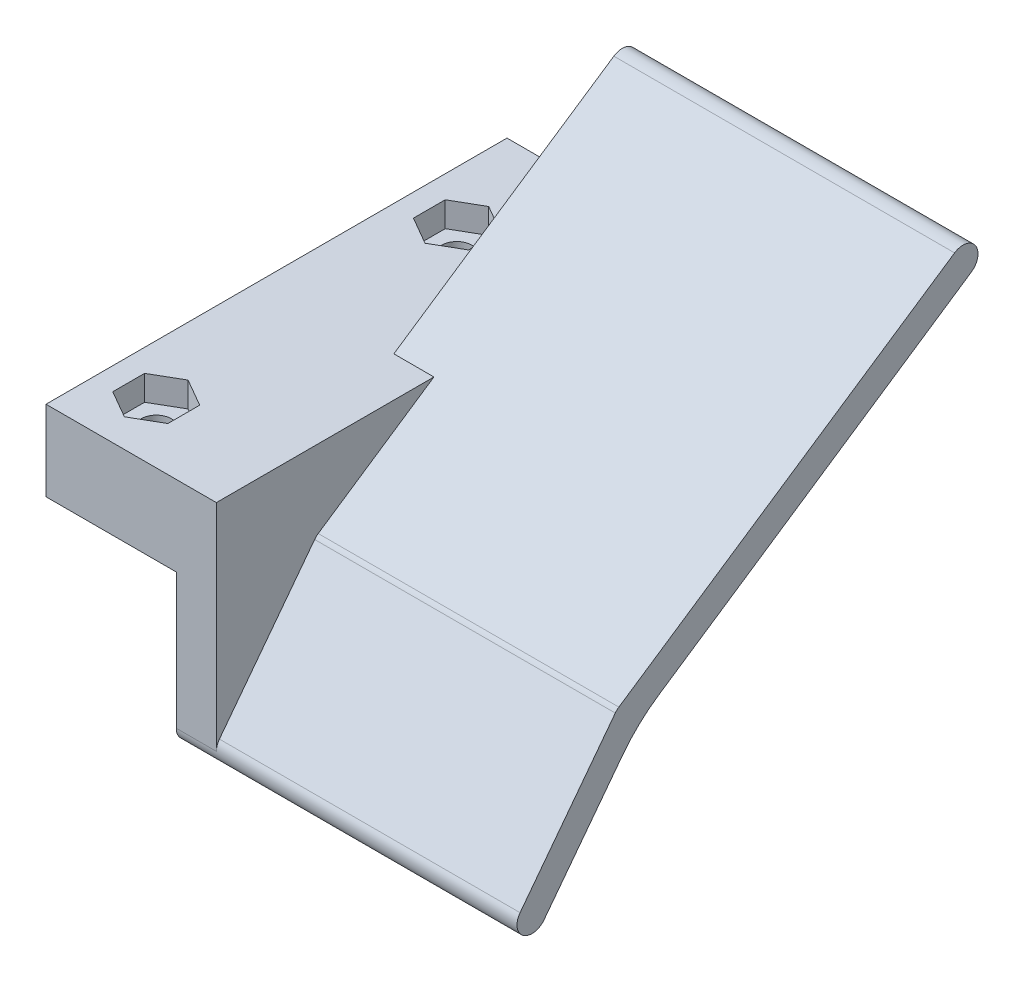
ISO-10303-21;
HEADER;
FILE_DESCRIPTION(('STEP AP214'),'2;1');
FILE_NAME('part.step','',(''),(''),'','','');
FILE_SCHEMA(('AUTOMOTIVE_DESIGN { 1 0 10303 214 1 1 1 1 }'));
ENDSEC;
DATA;
#1=APPLICATION_CONTEXT('core data for automotive mechanical design processes');
#2=APPLICATION_PROTOCOL_DEFINITION('international standard','automotive_design',2000,#1);
#3=PRODUCT_CONTEXT('',#1,'mechanical');
#4=PRODUCT('Part','Part','',(#3));
#5=PRODUCT_RELATED_PRODUCT_CATEGORY('part','',(#4));
#6=PRODUCT_DEFINITION_FORMATION('','',#4);
#7=PRODUCT_DEFINITION_CONTEXT('part definition',#1,'design');
#8=PRODUCT_DEFINITION('design','',#6,#7);
#9=PRODUCT_DEFINITION_SHAPE('','',#8);
#10=(LENGTH_UNIT() NAMED_UNIT(*) SI_UNIT(.MILLI.,.METRE.));
#11=(NAMED_UNIT(*) PLANE_ANGLE_UNIT() SI_UNIT($,.RADIAN.));
#12=(NAMED_UNIT(*) SI_UNIT($,.STERADIAN.) SOLID_ANGLE_UNIT());
#13=UNCERTAINTY_MEASURE_WITH_UNIT(LENGTH_MEASURE(1.E-05),#10,'distance_accuracy_value','');
#14=(GEOMETRIC_REPRESENTATION_CONTEXT(3) GLOBAL_UNCERTAINTY_ASSIGNED_CONTEXT((#13)) GLOBAL_UNIT_ASSIGNED_CONTEXT((#10,
#11,#12)) REPRESENTATION_CONTEXT('',''));
#15=CARTESIAN_POINT('',(0.,0.,0.));
#16=DIRECTION('',(0.,0.,1.));
#17=DIRECTION('',(1.,0.,0.));
#18=AXIS2_PLACEMENT_3D('',#15,#16,#17);
#19=CARTESIAN_POINT('',(61.,-8.,10.));
#20=DIRECTION('',(0.,1.,0.));
#21=DIRECTION('',(0.,0.,1.));
#22=AXIS2_PLACEMENT_3D('',#19,#20,#21);
#23=CYLINDRICAL_SURFACE('',#22,1.5);
#24=CARTESIAN_POINT('',(61.,-8.,10.));
#25=DIRECTION('',(0.,1.,0.));
#26=DIRECTION('',(0.,0.,1.));
#27=AXIS2_PLACEMENT_3D('',#24,#25,#26);
#28=CIRCLE('',#27,1.5);
#29=CARTESIAN_POINT('',(61.,-8.,11.5));
#30=VERTEX_POINT('',#29);
#31=EDGE_CURVE('E499',#30,#30,#28,.T.);
#32=ORIENTED_EDGE('',*,*,#31,.F.);
#33=EDGE_LOOP('',(#32));
#34=FACE_BOUND('',#33,.T.);
#35=CARTESIAN_POINT('',(61.,-2.5,10.));
#36=DIRECTION('',(0.,1.,0.));
#37=DIRECTION('',(0.,0.,1.));
#38=AXIS2_PLACEMENT_3D('',#35,#36,#37);
#39=CIRCLE('',#38,1.5);
#40=CARTESIAN_POINT('',(61.,-2.5,11.5));
#41=VERTEX_POINT('',#40);
#42=EDGE_CURVE('E51',#41,#41,#39,.F.);
#43=ORIENTED_EDGE('',*,*,#42,.F.);
#44=EDGE_LOOP('',(#43));
#45=FACE_BOUND('',#44,.T.);
#46=ADVANCED_FACE('F47',(#34,#45),#23,.F.);
#47=CARTESIAN_POINT('',(61.,-8.,40.));
#48=DIRECTION('',(0.,1.,0.));
#49=DIRECTION('',(0.,0.,1.));
#50=AXIS2_PLACEMENT_3D('',#47,#48,#49);
#51=CYLINDRICAL_SURFACE('',#50,1.5);
#52=CARTESIAN_POINT('',(61.,-8.,40.));
#53=DIRECTION('',(0.,1.,0.));
#54=DIRECTION('',(0.,0.,1.));
#55=AXIS2_PLACEMENT_3D('',#52,#53,#54);
#56=CIRCLE('',#55,1.5);
#57=CARTESIAN_POINT('',(61.,-8.,41.5));
#58=VERTEX_POINT('',#57);
#59=EDGE_CURVE('E484',#58,#58,#56,.T.);
#60=ORIENTED_EDGE('',*,*,#59,.F.);
#61=EDGE_LOOP('',(#60));
#62=FACE_BOUND('',#61,.T.);
#63=CARTESIAN_POINT('',(61.,-2.5,40.));
#64=DIRECTION('',(0.,1.,0.));
#65=DIRECTION('',(0.,0.,1.));
#66=AXIS2_PLACEMENT_3D('',#63,#64,#65);
#67=CIRCLE('',#66,1.5);
#68=CARTESIAN_POINT('',(61.,-2.5,41.5));
#69=VERTEX_POINT('',#68);
#70=EDGE_CURVE('E296',#69,#69,#67,.F.);
#71=ORIENTED_EDGE('',*,*,#70,.F.);
#72=EDGE_LOOP('',(#71));
#73=FACE_BOUND('',#72,.T.);
#74=ADVANCED_FACE('F556',(#62,#73),#51,.F.);
#75=CARTESIAN_POINT('',(56.,-8.,0.));
#76=DIRECTION('',(0.,0.,-1.));
#77=DIRECTION('',(-1.,0.,0.));
#78=AXIS2_PLACEMENT_3D('',#75,#76,#77);
#79=PLANE('',#78);
#80=DIRECTION('',(0.,1.,0.));
#81=VECTOR('',#80,1.);
#82=CARTESIAN_POINT('',(69.,-23.,0.));
#83=LINE('',#82,#81);
#84=CARTESIAN_POINT('',(69.,0.,0.));
#85=VERTEX_POINT('',#84);
#86=CARTESIAN_POINT('',(69.,13.5,0.));
#87=VERTEX_POINT('',#86);
#88=EDGE_CURVE('E485',#85,#87,#83,.T.);
#89=ORIENTED_EDGE('',*,*,#88,.T.);
#90=DIRECTION('',(1.,0.,0.));
#91=VECTOR('',#90,1.);
#92=CARTESIAN_POINT('',(55.999,13.5,0.));
#93=LINE('',#92,#91);
#94=CARTESIAN_POINT('',(73.,13.5,0.));
#95=VERTEX_POINT('',#94);
#96=EDGE_CURVE('E372',#87,#95,#93,.T.);
#97=ORIENTED_EDGE('',*,*,#96,.T.);
#98=DIRECTION('',(0.,1.,0.));
#99=VECTOR('',#98,1.);
#100=CARTESIAN_POINT('',(73.,-23.,0.));
#101=LINE('',#100,#99);
#102=CARTESIAN_POINT('',(73.,-8.,0.));
#103=VERTEX_POINT('',#102);
#104=EDGE_CURVE('E489',#103,#95,#101,.T.);
#105=ORIENTED_EDGE('',*,*,#104,.F.);
#106=DIRECTION('',(-1.,0.,0.));
#107=VECTOR('',#106,1.);
#108=CARTESIAN_POINT('',(56.,-8.,0.));
#109=LINE('',#108,#107);
#110=CARTESIAN_POINT('',(56.,-8.,0.));
#111=VERTEX_POINT('',#110);
#112=EDGE_CURVE('E513',#103,#111,#109,.T.);
#113=ORIENTED_EDGE('',*,*,#112,.T.);
#114=DIRECTION('',(0.,1.,0.));
#115=VECTOR('',#114,1.);
#116=CARTESIAN_POINT('',(56.,-8.,0.));
#117=LINE('',#116,#115);
#118=CARTESIAN_POINT('',(56.,0.,0.));
#119=VERTEX_POINT('',#118);
#120=EDGE_CURVE('E521',#111,#119,#117,.T.);
#121=ORIENTED_EDGE('',*,*,#120,.T.);
#122=DIRECTION('',(-1.,0.,0.));
#123=VECTOR('',#122,1.);
#124=CARTESIAN_POINT('',(56.,0.,0.));
#125=LINE('',#124,#123);
#126=EDGE_CURVE('E527',#85,#119,#125,.T.);
#127=ORIENTED_EDGE('',*,*,#126,.F.);
#128=EDGE_LOOP('',(#89,#97,#105,#113,#121,#127));
#129=FACE_BOUND('',#128,.T.);
#130=ADVANCED_FACE('F562',(#129),#79,.T.);
#131=CARTESIAN_POINT('',(69.,-23.,46.));
#132=DIRECTION('',(-1.,0.,0.));
#133=DIRECTION('',(0.,0.,1.));
#134=AXIS2_PLACEMENT_3D('',#131,#132,#133);
#135=PLANE('',#134);
#136=CARTESIAN_POINT('',(69.,13.5,1.5));
#137=DIRECTION('',(-1.,0.,0.));
#138=DIRECTION('',(0.,0.,1.));
#139=AXIS2_PLACEMENT_3D('',#136,#137,#138);
#140=CIRCLE('',#139,1.5);
#141=CARTESIAN_POINT('',(69.,14.7452088098158,2.33633427524944));
#142=VERTEX_POINT('',#141);
#143=EDGE_CURVE('E379',#142,#87,#140,.T.);
#144=ORIENTED_EDGE('',*,*,#143,.T.);
#145=ORIENTED_EDGE('',*,*,#88,.F.);
#146=DIRECTION('',(0.,0.,-1.));
#147=VECTOR('',#146,1.);
#148=CARTESIAN_POINT('',(69.,0.,0.));
#149=LINE('',#148,#147);
#150=CARTESIAN_POINT('',(69.,0.,24.2903118365308));
#151=VERTEX_POINT('',#150);
#152=EDGE_CURVE('E524',#151,#85,#149,.T.);
#153=ORIENTED_EDGE('',*,*,#152,.F.);
#154=DIRECTION('',(0.,0.55755618349963,-0.830139206543895));
#155=VECTOR('',#154,1.);
#156=CARTESIAN_POINT('',(69.,11.2427525617348,7.55110246683679));
#157=LINE('',#156,#155);
#158=EDGE_CURVE('E390',#151,#142,#157,.T.);
#159=ORIENTED_EDGE('',*,*,#158,.T.);
#160=EDGE_LOOP('',(#144,#145,#153,#159));
#161=FACE_BOUND('',#160,.T.);
#162=ADVANCED_FACE('F583',(#161),#135,.T.);
#163=CARTESIAN_POINT('',(69.,-8.,46.));
#164=DIRECTION('',(0.,0.,1.));
#165=DIRECTION('',(1.,0.,0.));
#166=AXIS2_PLACEMENT_3D('',#163,#164,#165);
#167=PLANE('',#166);
#168=DIRECTION('',(0.,1.,0.));
#169=VECTOR('',#168,1.);
#170=CARTESIAN_POINT('',(69.,-23.,46.));
#171=LINE('',#170,#169);
#172=CARTESIAN_POINT('',(69.,-21.5,46.));
#173=VERTEX_POINT('',#172);
#174=CARTESIAN_POINT('',(69.,-8.,46.));
#175=VERTEX_POINT('',#174);
#176=EDGE_CURVE('E481',#173,#175,#171,.T.);
#177=ORIENTED_EDGE('',*,*,#176,.F.);
#178=DIRECTION('',(1.,0.,0.));
#179=VECTOR('',#178,1.);
#180=CARTESIAN_POINT('',(55.999,-21.5,46.));
#181=LINE('',#180,#179);
#182=CARTESIAN_POINT('',(73.,-21.5,46.));
#183=VERTEX_POINT('',#182);
#184=EDGE_CURVE('E375',#173,#183,#181,.T.);
#185=ORIENTED_EDGE('',*,*,#184,.T.);
#186=DIRECTION('',(0.,1.,0.));
#187=VECTOR('',#186,1.);
#188=CARTESIAN_POINT('',(73.,-23.,46.));
#189=LINE('',#188,#187);
#190=CARTESIAN_POINT('',(73.,0.,46.));
#191=VERTEX_POINT('',#190);
#192=EDGE_CURVE('E480',#183,#191,#189,.T.);
#193=ORIENTED_EDGE('',*,*,#192,.T.);
#194=DIRECTION('',(1.,0.,0.));
#195=VECTOR('',#194,1.);
#196=CARTESIAN_POINT('',(69.,0.,46.));
#197=LINE('',#196,#195);
#198=CARTESIAN_POINT('',(56.,0.,46.));
#199=VERTEX_POINT('',#198);
#200=EDGE_CURVE('E503',#199,#191,#197,.T.);
#201=ORIENTED_EDGE('',*,*,#200,.F.);
#202=DIRECTION('',(0.,1.,0.));
#203=VECTOR('',#202,1.);
#204=CARTESIAN_POINT('',(56.,-8.,46.));
#205=LINE('',#204,#203);
#206=CARTESIAN_POINT('',(56.,-8.,46.));
#207=VERTEX_POINT('',#206);
#208=EDGE_CURVE('E534',#207,#199,#205,.T.);
#209=ORIENTED_EDGE('',*,*,#208,.F.);
#210=DIRECTION('',(1.,0.,0.));
#211=VECTOR('',#210,1.);
#212=CARTESIAN_POINT('',(69.,-8.,46.));
#213=LINE('',#212,#211);
#214=EDGE_CURVE('E504',#207,#175,#213,.T.);
#215=ORIENTED_EDGE('',*,*,#214,.T.);
#216=EDGE_LOOP('',(#177,#185,#193,#201,#209,#215));
#217=FACE_BOUND('',#216,.T.);
#218=ADVANCED_FACE('F585',(#217),#167,.T.);
#219=CARTESIAN_POINT('',(69.,-21.5,44.5));
#220=DIRECTION('',(-1.,0.,0.));
#221=DIRECTION('',(0.,0.,1.));
#222=AXIS2_PLACEMENT_3D('',#219,#220,#221);
#223=CIRCLE('',#222,1.5);
#224=CARTESIAN_POINT('',(69.,-22.4076249013003,43.3057567088153));
#225=VERTEX_POINT('',#224);
#226=EDGE_CURVE('E400',#173,#225,#223,.F.);
#227=ORIENTED_EDGE('',*,*,#226,.F.);
#228=ORIENTED_EDGE('',*,*,#176,.T.);
#229=DIRECTION('',(0.,0.,-1.));
#230=VECTOR('',#229,1.);
#231=CARTESIAN_POINT('',(69.,-8.,0.));
#232=LINE('',#231,#230);
#233=CARTESIAN_POINT('',(69.,-8.,30.8207992745803));
#234=VERTEX_POINT('',#233);
#235=EDGE_CURVE('E508',#175,#234,#232,.T.);
#236=ORIENTED_EDGE('',*,*,#235,.T.);
#237=DIRECTION('',(0.,0.55755618349963,-0.830139206543895));
#238=VECTOR('',#237,1.);
#239=CARTESIAN_POINT('',(69.,8.75233494210309,5.87843391633789));
#240=LINE('',#239,#238);
#241=CARTESIAN_POINT('',(69.,-8.71576074565748,31.8864874958925));
#242=VERTEX_POINT('',#241);
#243=EDGE_CURVE('E378',#242,#234,#240,.T.);
#244=ORIENTED_EDGE('',*,*,#243,.F.);
#245=CARTESIAN_POINT('',(69.,-21.1678488438159,23.5231447433981));
#246=DIRECTION('',(-1.,0.,0.));
#247=DIRECTION('',(0.,0.,1.));
#248=AXIS2_PLACEMENT_3D('',#245,#246,#247);
#249=CIRCLE('',#248,15.);
#250=CARTESIAN_POINT('',(69.,-12.0915998308125,35.4655776552446));
#251=VERTEX_POINT('',#250);
#252=EDGE_CURVE('E57',#242,#251,#249,.F.);
#253=ORIENTED_EDGE('',*,*,#252,.T.);
#254=DIRECTION('',(0.,-0.796162194123103,0.605083267533557));
#255=VECTOR('',#254,1.);
#256=CARTESIAN_POINT('',(69.,12.6582980195922,16.6556552889371));
#257=LINE('',#256,#255);
#258=EDGE_CURVE('E397',#251,#225,#257,.T.);
#259=ORIENTED_EDGE('',*,*,#258,.T.);
#260=EDGE_LOOP('',(#227,#228,#236,#244,#253,#259));
#261=FACE_BOUND('',#260,.T.);
#262=ADVANCED_FACE('F587',(#261),#135,.T.);
#263=CARTESIAN_POINT('',(73.,-23.,0.));
#264=DIRECTION('',(1.,0.,0.));
#265=DIRECTION('',(0.,0.,-1.));
#266=AXIS2_PLACEMENT_3D('',#263,#264,#265);
#267=PLANE('',#266);
#268=DIRECTION('',(0.,-0.557556183499631,0.830139206543894));
#269=VECTOR('',#268,1.);
#270=CARTESIAN_POINT('',(73.,8.7523349421031,5.87843391633791));
#271=LINE('',#270,#269);
#272=CARTESIAN_POINT('',(73.,12.2547911901842,0.663665724750555));
#273=VERTEX_POINT('',#272);
#274=CARTESIAN_POINT('',(73.,-7.99999999999999,30.8207992745803));
#275=VERTEX_POINT('',#274);
#276=EDGE_CURVE('E451',#273,#275,#271,.T.);
#277=ORIENTED_EDGE('',*,*,#276,.T.);
#278=DIRECTION('',(0.,0.,-1.));
#279=VECTOR('',#278,1.);
#280=CARTESIAN_POINT('',(73.,-8.,0.));
#281=LINE('',#280,#279);
#282=EDGE_CURVE('E404',#275,#103,#281,.T.);
#283=ORIENTED_EDGE('',*,*,#282,.T.);
#284=ORIENTED_EDGE('',*,*,#104,.T.);
#285=CARTESIAN_POINT('',(73.,13.5,1.5));
#286=DIRECTION('',(1.,0.,0.));
#287=DIRECTION('',(0.,0.,-1.));
#288=AXIS2_PLACEMENT_3D('',#285,#286,#287);
#289=CIRCLE('',#288,1.5);
#290=EDGE_CURVE('E416',#273,#95,#289,.T.);
#291=ORIENTED_EDGE('',*,*,#290,.F.);
#292=EDGE_LOOP('',(#277,#283,#284,#291));
#293=FACE_BOUND('',#292,.T.);
#294=ADVANCED_FACE('F593',(#293),#267,.T.);
#295=DIRECTION('',(0.,-0.55755618349963,0.830139206543895));
#296=VECTOR('',#295,1.);
#297=CARTESIAN_POINT('',(73.,11.2427525617348,7.55110246683679));
#298=LINE('',#297,#296);
#299=CARTESIAN_POINT('',(73.,0.,24.2903118365308));
#300=VERTEX_POINT('',#299);
#301=CARTESIAN_POINT('',(73.,-7.75479119018416,35.8363342752494));
#302=VERTEX_POINT('',#301);
#303=EDGE_CURVE('E394',#300,#302,#298,.T.);
#304=ORIENTED_EDGE('',*,*,#303,.F.);
#305=DIRECTION('',(0.,0.,1.));
#306=VECTOR('',#305,1.);
#307=CARTESIAN_POINT('',(73.,0.,0.));
#308=LINE('',#307,#306);
#309=EDGE_CURVE('E382',#300,#191,#308,.T.);
#310=ORIENTED_EDGE('',*,*,#309,.T.);
#311=ORIENTED_EDGE('',*,*,#192,.F.);
#312=CARTESIAN_POINT('',(73.,-21.5,44.5));
#313=DIRECTION('',(1.,0.,0.));
#314=DIRECTION('',(0.,0.,-1.));
#315=AXIS2_PLACEMENT_3D('',#312,#313,#314);
#316=CIRCLE('',#315,1.49999999999999);
#317=CARTESIAN_POINT('',(73.,-20.5923750986997,45.6942432911846));
#318=VERTEX_POINT('',#317);
#319=EDGE_CURVE('E447',#318,#183,#316,.T.);
#320=ORIENTED_EDGE('',*,*,#319,.F.);
#321=DIRECTION('',(0.,-0.796162194123103,0.605083267533557));
#322=VECTOR('',#321,1.);
#323=CARTESIAN_POINT('',(73.,14.4735478221928,19.0441418713064));
#324=LINE('',#323,#322);
#325=CARTESIAN_POINT('',(73.,-8.09237509869968,36.1942432911846));
#326=VERTEX_POINT('',#325);
#327=EDGE_CURVE('E443',#326,#318,#324,.T.);
#328=ORIENTED_EDGE('',*,*,#327,.F.);
#329=CARTESIAN_POINT('',(73.,-9.,35.));
#330=DIRECTION('',(1.,0.,0.));
#331=DIRECTION('',(0.,0.,-1.));
#332=AXIS2_PLACEMENT_3D('',#329,#330,#331);
#333=CIRCLE('',#332,1.49999999999999);
#334=EDGE_CURVE('E439',#302,#326,#333,.T.);
#335=ORIENTED_EDGE('',*,*,#334,.F.);
#336=EDGE_LOOP('',(#304,#310,#311,#320,#328,#335));
#337=FACE_BOUND('',#336,.T.);
#338=ADVANCED_FACE('F580',(#337),#267,.T.);
#339=CARTESIAN_POINT('',(56.,-8.,0.));
#340=DIRECTION('',(-1.,0.,0.));
#341=DIRECTION('',(0.,0.,1.));
#342=AXIS2_PLACEMENT_3D('',#339,#340,#341);
#343=PLANE('',#342);
#344=DIRECTION('',(0.,0.,1.));
#345=VECTOR('',#344,1.);
#346=CARTESIAN_POINT('',(56.,0.,0.));
#347=LINE('',#346,#345);
#348=EDGE_CURVE('E509',#119,#199,#347,.T.);
#349=ORIENTED_EDGE('',*,*,#348,.F.);
#350=ORIENTED_EDGE('',*,*,#120,.F.);
#351=DIRECTION('',(0.,0.,1.));
#352=VECTOR('',#351,1.);
#353=CARTESIAN_POINT('',(56.,-8.,0.));
#354=LINE('',#353,#352);
#355=EDGE_CURVE('E517',#111,#207,#354,.T.);
#356=ORIENTED_EDGE('',*,*,#355,.T.);
#357=ORIENTED_EDGE('',*,*,#208,.T.);
#358=EDGE_LOOP('',(#349,#350,#356,#357));
#359=FACE_BOUND('',#358,.T.);
#360=ADVANCED_FACE('F572',(#359),#343,.T.);
#361=CARTESIAN_POINT('',(0.,-8.,0.));
#362=DIRECTION('',(0.,1.,0.));
#363=DIRECTION('',(0.,0.,1.));
#364=AXIS2_PLACEMENT_3D('',#361,#362,#363);
#365=PLANE('',#364);
#366=ORIENTED_EDGE('',*,*,#59,.T.);
#367=EDGE_LOOP('',(#366));
#368=FACE_BOUND('',#367,.T.);
#369=ORIENTED_EDGE('',*,*,#31,.T.);
#370=EDGE_LOOP('',(#369));
#371=FACE_BOUND('',#370,.T.);
#372=ORIENTED_EDGE('',*,*,#214,.F.);
#373=ORIENTED_EDGE('',*,*,#355,.F.);
#374=ORIENTED_EDGE('',*,*,#112,.F.);
#375=ORIENTED_EDGE('',*,*,#282,.F.);
#376=DIRECTION('',(1.,0.,0.));
#377=VECTOR('',#376,1.);
#378=CARTESIAN_POINT('',(55.999,-8.,30.8207992745803));
#379=LINE('',#378,#377);
#380=EDGE_CURVE('E383',#234,#275,#379,.T.);
#381=ORIENTED_EDGE('',*,*,#380,.F.);
#382=ORIENTED_EDGE('',*,*,#235,.F.);
#383=EDGE_LOOP('',(#372,#373,#374,#375,#381,#382));
#384=FACE_BOUND('',#383,.T.);
#385=ADVANCED_FACE('F568',(#368,#371,#384),#365,.F.);
#386=CARTESIAN_POINT('',(0.,0.,0.));
#387=DIRECTION('',(0.,1.,0.));
#388=DIRECTION('',(0.,0.,1.));
#389=AXIS2_PLACEMENT_3D('',#386,#387,#388);
#390=PLANE('',#389);
#391=DIRECTION('',(0.866025403784437,0.,-0.500000000000003));
#392=VECTOR('',#391,1.);
#393=CARTESIAN_POINT('',(61.,0.,13.1754264805429));
#394=LINE('',#393,#392);
#395=CARTESIAN_POINT('',(61.,0.,13.1754264805429));
#396=VERTEX_POINT('',#395);
#397=CARTESIAN_POINT('',(63.75,0.,11.5877132402715));
#398=VERTEX_POINT('',#397);
#399=EDGE_CURVE('E65',#396,#398,#394,.T.);
#400=ORIENTED_EDGE('',*,*,#399,.F.);
#401=DIRECTION('',(0.866025403784439,0.,0.5));
#402=VECTOR('',#401,1.);
#403=CARTESIAN_POINT('',(58.25,0.,11.5877132402715));
#404=LINE('',#403,#402);
#405=CARTESIAN_POINT('',(58.25,0.,11.5877132402715));
#406=VERTEX_POINT('',#405);
#407=EDGE_CURVE('E259',#406,#396,#404,.T.);
#408=ORIENTED_EDGE('',*,*,#407,.F.);
#409=DIRECTION('',(0.,0.,1.));
#410=VECTOR('',#409,1.);
#411=CARTESIAN_POINT('',(58.25,0.,8.41228675972854));
#412=LINE('',#411,#410);
#413=CARTESIAN_POINT('',(58.25,0.,8.41228675972854));
#414=VERTEX_POINT('',#413);
#415=EDGE_CURVE('E263',#414,#406,#412,.T.);
#416=ORIENTED_EDGE('',*,*,#415,.F.);
#417=DIRECTION('',(-0.866025403784437,0.,0.500000000000002));
#418=VECTOR('',#417,1.);
#419=CARTESIAN_POINT('',(61.,0.,6.82457351945707));
#420=LINE('',#419,#418);
#421=CARTESIAN_POINT('',(61.,0.,6.82457351945707));
#422=VERTEX_POINT('',#421);
#423=EDGE_CURVE('E286',#422,#414,#420,.T.);
#424=ORIENTED_EDGE('',*,*,#423,.F.);
#425=DIRECTION('',(-0.866025403784439,0.,-0.499999999999999));
#426=VECTOR('',#425,1.);
#427=CARTESIAN_POINT('',(63.75,0.,8.41228675972853));
#428=LINE('',#427,#426);
#429=CARTESIAN_POINT('',(63.75,0.,8.41228675972853));
#430=VERTEX_POINT('',#429);
#431=EDGE_CURVE('E282',#430,#422,#428,.T.);
#432=ORIENTED_EDGE('',*,*,#431,.F.);
#433=DIRECTION('',(0.,0.,-1.));
#434=VECTOR('',#433,1.);
#435=CARTESIAN_POINT('',(63.75,0.,11.5877132402715));
#436=LINE('',#435,#434);
#437=EDGE_CURVE('E279',#398,#430,#436,.T.);
#438=ORIENTED_EDGE('',*,*,#437,.F.);
#439=EDGE_LOOP('',(#400,#408,#416,#424,#432,#438));
#440=FACE_BOUND('',#439,.T.);
#441=DIRECTION('',(0.866025403784438,0.,0.5));
#442=VECTOR('',#441,1.);
#443=CARTESIAN_POINT('',(58.25,0.,41.5877132402715));
#444=LINE('',#443,#442);
#445=CARTESIAN_POINT('',(58.25,0.,41.5877132402715));
#446=VERTEX_POINT('',#445);
#447=CARTESIAN_POINT('',(61.,0.,43.175426480543));
#448=VERTEX_POINT('',#447);
#449=EDGE_CURVE('E73',#446,#448,#444,.T.);
#450=ORIENTED_EDGE('',*,*,#449,.F.);
#451=DIRECTION('',(0.,0.,1.));
#452=VECTOR('',#451,1.);
#453=CARTESIAN_POINT('',(58.25,0.,38.4122867597285));
#454=LINE('',#453,#452);
#455=CARTESIAN_POINT('',(58.25,0.,38.4122867597285));
#456=VERTEX_POINT('',#455);
#457=EDGE_CURVE('E327',#456,#446,#454,.T.);
#458=ORIENTED_EDGE('',*,*,#457,.F.);
#459=DIRECTION('',(-0.866025403784442,0.,0.499999999999994));
#460=VECTOR('',#459,1.);
#461=CARTESIAN_POINT('',(61.,0.,36.8245735194571));
#462=LINE('',#461,#460);
#463=CARTESIAN_POINT('',(61.,0.,36.8245735194571));
#464=VERTEX_POINT('',#463);
#465=EDGE_CURVE('E331',#464,#456,#462,.T.);
#466=ORIENTED_EDGE('',*,*,#465,.F.);
#467=DIRECTION('',(-0.866025403784437,0.,-0.500000000000002));
#468=VECTOR('',#467,1.);
#469=CARTESIAN_POINT('',(63.75,0.,38.4122867597286));
#470=LINE('',#469,#468);
#471=CARTESIAN_POINT('',(63.75,0.,38.4122867597286));
#472=VERTEX_POINT('',#471);
#473=EDGE_CURVE('E336',#472,#464,#470,.T.);
#474=ORIENTED_EDGE('',*,*,#473,.F.);
#475=DIRECTION('',(0.,0.,-1.));
#476=VECTOR('',#475,1.);
#477=CARTESIAN_POINT('',(63.75,0.,41.5877132402715));
#478=LINE('',#477,#476);
#479=CARTESIAN_POINT('',(63.75,0.,41.5877132402715));
#480=VERTEX_POINT('',#479);
#481=EDGE_CURVE('E340',#480,#472,#478,.T.);
#482=ORIENTED_EDGE('',*,*,#481,.F.);
#483=DIRECTION('',(0.866025403784439,0.,-0.5));
#484=VECTOR('',#483,1.);
#485=CARTESIAN_POINT('',(61.,0.,43.1754264805429));
#486=LINE('',#485,#484);
#487=EDGE_CURVE('E344',#448,#480,#486,.T.);
#488=ORIENTED_EDGE('',*,*,#487,.F.);
#489=EDGE_LOOP('',(#450,#458,#466,#474,#482,#488));
#490=FACE_BOUND('',#489,.T.);
#491=ORIENTED_EDGE('',*,*,#200,.T.);
#492=ORIENTED_EDGE('',*,*,#309,.F.);
#493=DIRECTION('',(1.,0.,0.));
#494=VECTOR('',#493,1.);
#495=CARTESIAN_POINT('',(55.999,0.,24.2903118365308));
#496=LINE('',#495,#494);
#497=EDGE_CURVE('E387',#151,#300,#496,.T.);
#498=ORIENTED_EDGE('',*,*,#497,.F.);
#499=ORIENTED_EDGE('',*,*,#152,.T.);
#500=ORIENTED_EDGE('',*,*,#126,.T.);
#501=ORIENTED_EDGE('',*,*,#348,.T.);
#502=EDGE_LOOP('',(#491,#492,#498,#499,#500,#501));
#503=FACE_BOUND('',#502,.T.);
#504=ADVANCED_FACE('F571',(#440,#490,#503),#390,.T.);
#505=CARTESIAN_POINT('',(103.,11.2427525617348,7.55110246683679));
#506=DIRECTION('',(0.,-0.830139206543894,-0.55755618349963));
#507=DIRECTION('',(0.,0.55755618349963,-0.830139206543895));
#508=AXIS2_PLACEMENT_3D('',#505,#506,#507);
#509=PLANE('',#508);
#510=DIRECTION('',(-1.,0.,0.));
#511=VECTOR('',#510,1.);
#512=CARTESIAN_POINT('',(103.,14.7452088098158,2.33633427524945));
#513=LINE('',#512,#511);
#514=CARTESIAN_POINT('',(103.,14.7452088098158,2.33633427524945));
#515=VERTEX_POINT('',#514);
#516=EDGE_CURVE('E436',#515,#142,#513,.T.);
#517=ORIENTED_EDGE('',*,*,#516,.T.);
#518=ORIENTED_EDGE('',*,*,#158,.F.);
#519=ORIENTED_EDGE('',*,*,#497,.T.);
#520=ORIENTED_EDGE('',*,*,#303,.T.);
#521=DIRECTION('',(-1.,0.,0.));
#522=VECTOR('',#521,1.);
#523=CARTESIAN_POINT('',(103.,-7.75479119018416,35.8363342752494));
#524=LINE('',#523,#522);
#525=CARTESIAN_POINT('',(103.,-7.75479119018416,35.8363342752494));
#526=VERTEX_POINT('',#525);
#527=EDGE_CURVE('E476',#526,#302,#524,.T.);
#528=ORIENTED_EDGE('',*,*,#527,.F.);
#529=DIRECTION('',(0.,-0.55755618349963,0.830139206543895));
#530=VECTOR('',#529,1.);
#531=CARTESIAN_POINT('',(103.,11.2427525617348,7.55110246683679));
#532=LINE('',#531,#530);
#533=EDGE_CURVE('E411',#515,#526,#532,.T.);
#534=ORIENTED_EDGE('',*,*,#533,.F.);
#535=EDGE_LOOP('',(#517,#518,#519,#520,#528,#534));
#536=FACE_BOUND('',#535,.T.);
#537=ADVANCED_FACE('F576',(#536),#509,.F.);
#538=CARTESIAN_POINT('',(103.,-9.,35.));
#539=DIRECTION('',(-1.,0.,0.));
#540=DIRECTION('',(0.,0.,1.));
#541=AXIS2_PLACEMENT_3D('',#538,#539,#540);
#542=CYLINDRICAL_SURFACE('',#541,1.49999999999999);
#543=ORIENTED_EDGE('',*,*,#334,.T.);
#544=DIRECTION('',(-1.,0.,0.));
#545=VECTOR('',#544,1.);
#546=CARTESIAN_POINT('',(103.,-8.09237509869968,36.1942432911846));
#547=LINE('',#546,#545);
#548=CARTESIAN_POINT('',(103.,-8.09237509869968,36.1942432911846));
#549=VERTEX_POINT('',#548);
#550=EDGE_CURVE('E472',#549,#326,#547,.T.);
#551=ORIENTED_EDGE('',*,*,#550,.F.);
#552=CARTESIAN_POINT('',(103.,-9.,35.));
#553=DIRECTION('',(1.,0.,0.));
#554=DIRECTION('',(0.,0.,-1.));
#555=AXIS2_PLACEMENT_3D('',#552,#553,#554);
#556=CIRCLE('',#555,1.49999999999999);
#557=EDGE_CURVE('E415',#526,#549,#556,.T.);
#558=ORIENTED_EDGE('',*,*,#557,.F.);
#559=ORIENTED_EDGE('',*,*,#527,.T.);
#560=EDGE_LOOP('',(#543,#551,#558,#559));
#561=FACE_BOUND('',#560,.T.);
#562=ADVANCED_FACE('F639',(#561),#542,.T.);
#563=CARTESIAN_POINT('',(103.,14.4735478221928,19.0441418713064));
#564=DIRECTION('',(0.,-0.605083267533557,-0.796162194123103));
#565=DIRECTION('',(0.,0.796162194123103,-0.605083267533557));
#566=AXIS2_PLACEMENT_3D('',#563,#564,#565);
#567=PLANE('',#566);
#568=ORIENTED_EDGE('',*,*,#327,.T.);
#569=DIRECTION('',(-1.,0.,0.));
#570=VECTOR('',#569,1.);
#571=CARTESIAN_POINT('',(103.,-20.5923750986997,45.6942432911846));
#572=LINE('',#571,#570);
#573=CARTESIAN_POINT('',(103.,-20.5923750986997,45.6942432911846));
#574=VERTEX_POINT('',#573);
#575=EDGE_CURVE('E468',#574,#318,#572,.T.);
#576=ORIENTED_EDGE('',*,*,#575,.F.);
#577=DIRECTION('',(0.,-0.796162194123103,0.605083267533557));
#578=VECTOR('',#577,1.);
#579=CARTESIAN_POINT('',(103.,14.4735478221928,19.0441418713064));
#580=LINE('',#579,#578);
#581=EDGE_CURVE('E419',#549,#574,#580,.T.);
#582=ORIENTED_EDGE('',*,*,#581,.F.);
#583=ORIENTED_EDGE('',*,*,#550,.T.);
#584=EDGE_LOOP('',(#568,#576,#582,#583));
#585=FACE_BOUND('',#584,.T.);
#586=ADVANCED_FACE('F635',(#585),#567,.F.);
#587=CARTESIAN_POINT('',(103.,-21.5,44.5));
#588=DIRECTION('',(-1.,0.,0.));
#589=DIRECTION('',(0.,0.,1.));
#590=AXIS2_PLACEMENT_3D('',#587,#588,#589);
#591=CYLINDRICAL_SURFACE('',#590,1.49999999999999);
#592=ORIENTED_EDGE('',*,*,#319,.T.);
#593=ORIENTED_EDGE('',*,*,#184,.F.);
#594=ORIENTED_EDGE('',*,*,#226,.T.);
#595=DIRECTION('',(-1.,0.,0.));
#596=VECTOR('',#595,1.);
#597=CARTESIAN_POINT('',(103.,-22.4076249013003,43.3057567088153));
#598=LINE('',#597,#596);
#599=CARTESIAN_POINT('',(103.,-22.4076249013003,43.3057567088153));
#600=VERTEX_POINT('',#599);
#601=EDGE_CURVE('E464',#600,#225,#598,.T.);
#602=ORIENTED_EDGE('',*,*,#601,.F.);
#603=CARTESIAN_POINT('',(103.,-21.5,44.5));
#604=DIRECTION('',(1.,0.,0.));
#605=DIRECTION('',(0.,0.,-1.));
#606=AXIS2_PLACEMENT_3D('',#603,#604,#605);
#607=CIRCLE('',#606,1.49999999999999);
#608=EDGE_CURVE('E422',#574,#600,#607,.T.);
#609=ORIENTED_EDGE('',*,*,#608,.F.);
#610=ORIENTED_EDGE('',*,*,#575,.T.);
#611=EDGE_LOOP('',(#592,#593,#594,#602,#609,#610));
#612=FACE_BOUND('',#611,.T.);
#613=ADVANCED_FACE('F629',(#612),#591,.T.);
#614=CARTESIAN_POINT('',(103.,12.6582980195922,16.6556552889371));
#615=DIRECTION('',(0.,-0.605083267533557,-0.796162194123103));
#616=DIRECTION('',(0.,0.796162194123103,-0.605083267533557));
#617=AXIS2_PLACEMENT_3D('',#614,#615,#616);
#618=PLANE('',#617);
#619=ORIENTED_EDGE('',*,*,#258,.F.);
#620=DIRECTION('',(-1.,0.,0.));
#621=VECTOR('',#620,1.);
#622=CARTESIAN_POINT('',(103.,-12.0915998308125,35.4655776552446));
#623=LINE('',#622,#621);
#624=CARTESIAN_POINT('',(103.,-12.0915998308125,35.4655776552446));
#625=VERTEX_POINT('',#624);
#626=EDGE_CURVE('E543',#251,#625,#623,.F.);
#627=ORIENTED_EDGE('',*,*,#626,.T.);
#628=DIRECTION('',(0.,-0.796162194123103,0.605083267533557));
#629=VECTOR('',#628,1.);
#630=CARTESIAN_POINT('',(103.,12.6582980195922,16.6556552889371));
#631=LINE('',#630,#629);
#632=EDGE_CURVE('E426',#625,#600,#631,.T.);
#633=ORIENTED_EDGE('',*,*,#632,.T.);
#634=ORIENTED_EDGE('',*,*,#601,.T.);
#635=EDGE_LOOP('',(#619,#627,#633,#634));
#636=FACE_BOUND('',#635,.T.);
#637=ADVANCED_FACE('F624',(#636),#618,.T.);
#638=CARTESIAN_POINT('',(103.,8.7523349421031,5.87843391633791));
#639=DIRECTION('',(0.,-0.830139206543894,-0.557556183499631));
#640=DIRECTION('',(0.,0.557556183499631,-0.830139206543894));
#641=AXIS2_PLACEMENT_3D('',#638,#639,#640);
#642=PLANE('',#641);
#643=DIRECTION('',(0.,-0.557556183499631,0.830139206543894));
#644=VECTOR('',#643,1.);
#645=CARTESIAN_POINT('',(103.,8.7523349421031,5.87843391633791));
#646=LINE('',#645,#644);
#647=CARTESIAN_POINT('',(103.,12.2547911901842,0.663665724750555));
#648=VERTEX_POINT('',#647);
#649=CARTESIAN_POINT('',(103.,-8.71576074565747,31.8864874958925));
#650=VERTEX_POINT('',#649);
#651=EDGE_CURVE('E429',#648,#650,#646,.T.);
#652=ORIENTED_EDGE('',*,*,#651,.T.);
#653=DIRECTION('',(-1.,0.,0.));
#654=VECTOR('',#653,1.);
#655=CARTESIAN_POINT('',(69.,-8.71576074565748,31.8864874958925));
#656=LINE('',#655,#654);
#657=EDGE_CURVE('E537',#650,#242,#656,.T.);
#658=ORIENTED_EDGE('',*,*,#657,.T.);
#659=ORIENTED_EDGE('',*,*,#243,.T.);
#660=ORIENTED_EDGE('',*,*,#380,.T.);
#661=ORIENTED_EDGE('',*,*,#276,.F.);
#662=DIRECTION('',(-1.,0.,0.));
#663=VECTOR('',#662,1.);
#664=CARTESIAN_POINT('',(103.,12.2547911901842,0.663665724750555));
#665=LINE('',#664,#663);
#666=EDGE_CURVE('E460',#648,#273,#665,.T.);
#667=ORIENTED_EDGE('',*,*,#666,.F.);
#668=EDGE_LOOP('',(#652,#658,#659,#660,#661,#667));
#669=FACE_BOUND('',#668,.T.);
#670=ADVANCED_FACE('F608',(#669),#642,.T.);
#671=CARTESIAN_POINT('',(103.,13.5,1.5));
#672=DIRECTION('',(-1.,0.,0.));
#673=DIRECTION('',(0.,0.,1.));
#674=AXIS2_PLACEMENT_3D('',#671,#672,#673);
#675=CYLINDRICAL_SURFACE('',#674,1.5);
#676=ORIENTED_EDGE('',*,*,#290,.T.);
#677=ORIENTED_EDGE('',*,*,#96,.F.);
#678=ORIENTED_EDGE('',*,*,#143,.F.);
#679=ORIENTED_EDGE('',*,*,#516,.F.);
#680=CARTESIAN_POINT('',(103.,13.5,1.5));
#681=DIRECTION('',(1.,0.,0.));
#682=DIRECTION('',(0.,0.,-1.));
#683=AXIS2_PLACEMENT_3D('',#680,#681,#682);
#684=CIRCLE('',#683,1.5);
#685=EDGE_CURVE('E433',#648,#515,#684,.T.);
#686=ORIENTED_EDGE('',*,*,#685,.F.);
#687=ORIENTED_EDGE('',*,*,#666,.T.);
#688=EDGE_LOOP('',(#676,#677,#678,#679,#686,#687));
#689=FACE_BOUND('',#688,.T.);
#690=ADVANCED_FACE('F614',(#689),#675,.T.);
#691=CARTESIAN_POINT('',(103.,0.,0.));
#692=DIRECTION('',(1.,0.,0.));
#693=DIRECTION('',(0.,0.,-1.));
#694=AXIS2_PLACEMENT_3D('',#691,#692,#693);
#695=PLANE('',#694);
#696=ORIENTED_EDGE('',*,*,#533,.T.);
#697=ORIENTED_EDGE('',*,*,#557,.T.);
#698=ORIENTED_EDGE('',*,*,#581,.T.);
#699=ORIENTED_EDGE('',*,*,#608,.T.);
#700=ORIENTED_EDGE('',*,*,#632,.F.);
#701=CARTESIAN_POINT('',(103.,-21.1678488438159,23.5231447433981));
#702=DIRECTION('',(1.,0.,0.));
#703=DIRECTION('',(0.,0.,-1.));
#704=AXIS2_PLACEMENT_3D('',#701,#702,#703);
#705=CIRCLE('',#704,15.);
#706=EDGE_CURVE('E12',#625,#650,#705,.F.);
#707=ORIENTED_EDGE('',*,*,#706,.T.);
#708=ORIENTED_EDGE('',*,*,#651,.F.);
#709=ORIENTED_EDGE('',*,*,#685,.T.);
#710=EDGE_LOOP('',(#696,#697,#698,#699,#700,#707,#708,#709));
#711=FACE_BOUND('',#710,.T.);
#712=ADVANCED_FACE('F652',(#711),#695,.T.);
#713=CARTESIAN_POINT('',(103.,-21.1678488438159,23.5231447433981));
#714=DIRECTION('',(1.,0.,0.));
#715=DIRECTION('',(0.,0.,-1.));
#716=AXIS2_PLACEMENT_3D('',#713,#714,#715);
#717=CYLINDRICAL_SURFACE('',#716,15.);
#718=ORIENTED_EDGE('',*,*,#706,.F.);
#719=ORIENTED_EDGE('',*,*,#626,.F.);
#720=ORIENTED_EDGE('',*,*,#252,.F.);
#721=ORIENTED_EDGE('',*,*,#657,.F.);
#722=EDGE_LOOP('',(#718,#719,#720,#721));
#723=FACE_BOUND('',#722,.T.);
#724=ADVANCED_FACE('F49',(#723),#717,.F.);
#725=CARTESIAN_POINT('',(0.,-2.5,0.));
#726=DIRECTION('',(0.,1.,0.));
#727=DIRECTION('',(0.,0.,1.));
#728=AXIS2_PLACEMENT_3D('',#725,#726,#727);
#729=PLANE('',#728);
#730=DIRECTION('',(0.866025403784438,0.,0.5));
#731=VECTOR('',#730,1.);
#732=CARTESIAN_POINT('',(58.25,-2.5,41.5877132402715));
#733=LINE('',#732,#731);
#734=CARTESIAN_POINT('',(58.25,-2.5,41.5877132402715));
#735=VERTEX_POINT('',#734);
#736=CARTESIAN_POINT('',(61.,-2.5,43.1754264805429));
#737=VERTEX_POINT('',#736);
#738=EDGE_CURVE('E332',#735,#737,#733,.T.);
#739=ORIENTED_EDGE('',*,*,#738,.T.);
#740=DIRECTION('',(0.866025403784439,0.,-0.5));
#741=VECTOR('',#740,1.);
#742=CARTESIAN_POINT('',(61.,-2.5,43.1754264805429));
#743=LINE('',#742,#741);
#744=CARTESIAN_POINT('',(63.75,-2.5,41.5877132402715));
#745=VERTEX_POINT('',#744);
#746=EDGE_CURVE('E365',#737,#745,#743,.T.);
#747=ORIENTED_EDGE('',*,*,#746,.T.);
#748=DIRECTION('',(0.,0.,-1.));
#749=VECTOR('',#748,1.);
#750=CARTESIAN_POINT('',(63.75,-2.5,41.5877132402715));
#751=LINE('',#750,#749);
#752=CARTESIAN_POINT('',(63.75,-2.5,38.4122867597286));
#753=VERTEX_POINT('',#752);
#754=EDGE_CURVE('E361',#745,#753,#751,.T.);
#755=ORIENTED_EDGE('',*,*,#754,.T.);
#756=DIRECTION('',(-0.866025403784437,0.,-0.500000000000002));
#757=VECTOR('',#756,1.);
#758=CARTESIAN_POINT('',(63.75,-2.5,38.4122867597286));
#759=LINE('',#758,#757);
#760=CARTESIAN_POINT('',(61.,-2.5,36.8245735194571));
#761=VERTEX_POINT('',#760);
#762=EDGE_CURVE('E357',#753,#761,#759,.T.);
#763=ORIENTED_EDGE('',*,*,#762,.T.);
#764=DIRECTION('',(-0.866025403784442,0.,0.499999999999994));
#765=VECTOR('',#764,1.);
#766=CARTESIAN_POINT('',(61.,-2.5,36.8245735194571));
#767=LINE('',#766,#765);
#768=CARTESIAN_POINT('',(58.25,-2.5,38.4122867597285));
#769=VERTEX_POINT('',#768);
#770=EDGE_CURVE('E353',#761,#769,#767,.T.);
#771=ORIENTED_EDGE('',*,*,#770,.T.);
#772=DIRECTION('',(0.,0.,1.));
#773=VECTOR('',#772,1.);
#774=CARTESIAN_POINT('',(58.25,-2.5,38.4122867597285));
#775=LINE('',#774,#773);
#776=EDGE_CURVE('E311',#769,#735,#775,.T.);
#777=ORIENTED_EDGE('',*,*,#776,.T.);
#778=EDGE_LOOP('',(#739,#747,#755,#763,#771,#777));
#779=FACE_BOUND('',#778,.T.);
#780=ORIENTED_EDGE('',*,*,#70,.T.);
#781=EDGE_LOOP('',(#780));
#782=FACE_BOUND('',#781,.T.);
#783=ADVANCED_FACE('F659',(#779,#782),#729,.T.);
#784=CARTESIAN_POINT('',(58.25,-2.5,41.5877132402715));
#785=DIRECTION('',(-0.5,0.,0.866025403784438));
#786=DIRECTION('',(0.866025403784438,0.,0.5));
#787=AXIS2_PLACEMENT_3D('',#784,#785,#786);
#788=PLANE('',#787);
#789=ORIENTED_EDGE('',*,*,#449,.T.);
#790=DIRECTION('',(0.,1.,0.));
#791=VECTOR('',#790,1.);
#792=CARTESIAN_POINT('',(61.,-2.5,43.1754264805429));
#793=LINE('',#792,#791);
#794=EDGE_CURVE('E308',#737,#448,#793,.T.);
#795=ORIENTED_EDGE('',*,*,#794,.F.);
#796=ORIENTED_EDGE('',*,*,#738,.F.);
#797=DIRECTION('',(0.,1.,0.));
#798=VECTOR('',#797,1.);
#799=CARTESIAN_POINT('',(58.25,-2.5,41.5877132402715));
#800=LINE('',#799,#798);
#801=EDGE_CURVE('E324',#735,#446,#800,.T.);
#802=ORIENTED_EDGE('',*,*,#801,.T.);
#803=EDGE_LOOP('',(#789,#795,#796,#802));
#804=FACE_BOUND('',#803,.T.);
#805=ADVANCED_FACE('F890',(#804),#788,.F.);
#806=CARTESIAN_POINT('',(58.25,-2.5,38.4122867597285));
#807=DIRECTION('',(-1.,0.,0.));
#808=DIRECTION('',(0.,0.,1.));
#809=AXIS2_PLACEMENT_3D('',#806,#807,#808);
#810=PLANE('',#809);
#811=ORIENTED_EDGE('',*,*,#457,.T.);
#812=ORIENTED_EDGE('',*,*,#801,.F.);
#813=ORIENTED_EDGE('',*,*,#776,.F.);
#814=DIRECTION('',(0.,1.,0.));
#815=VECTOR('',#814,1.);
#816=CARTESIAN_POINT('',(58.25,-2.5,38.4122867597285));
#817=LINE('',#816,#815);
#818=EDGE_CURVE('E321',#769,#456,#817,.T.);
#819=ORIENTED_EDGE('',*,*,#818,.T.);
#820=EDGE_LOOP('',(#811,#812,#813,#819));
#821=FACE_BOUND('',#820,.T.);
#822=ADVANCED_FACE('F900',(#821),#810,.F.);
#823=CARTESIAN_POINT('',(61.,-2.5,36.8245735194571));
#824=DIRECTION('',(-0.499999999999994,0.,-0.866025403784442));
#825=DIRECTION('',(-0.866025403784442,0.,0.499999999999994));
#826=AXIS2_PLACEMENT_3D('',#823,#824,#825);
#827=PLANE('',#826);
#828=ORIENTED_EDGE('',*,*,#465,.T.);
#829=ORIENTED_EDGE('',*,*,#818,.F.);
#830=ORIENTED_EDGE('',*,*,#770,.F.);
#831=DIRECTION('',(0.,1.,0.));
#832=VECTOR('',#831,1.);
#833=CARTESIAN_POINT('',(61.,-2.5,36.8245735194571));
#834=LINE('',#833,#832);
#835=EDGE_CURVE('E318',#761,#464,#834,.T.);
#836=ORIENTED_EDGE('',*,*,#835,.T.);
#837=EDGE_LOOP('',(#828,#829,#830,#836));
#838=FACE_BOUND('',#837,.T.);
#839=ADVANCED_FACE('F910',(#838),#827,.F.);
#840=CARTESIAN_POINT('',(63.75,-2.5,38.4122867597286));
#841=DIRECTION('',(0.500000000000002,0.,-0.866025403784437));
#842=DIRECTION('',(-0.866025403784437,0.,-0.500000000000002));
#843=AXIS2_PLACEMENT_3D('',#840,#841,#842);
#844=PLANE('',#843);
#845=ORIENTED_EDGE('',*,*,#473,.T.);
#846=ORIENTED_EDGE('',*,*,#835,.F.);
#847=ORIENTED_EDGE('',*,*,#762,.F.);
#848=DIRECTION('',(0.,1.,0.));
#849=VECTOR('',#848,1.);
#850=CARTESIAN_POINT('',(63.75,-2.5,38.4122867597286));
#851=LINE('',#850,#849);
#852=EDGE_CURVE('E315',#753,#472,#851,.T.);
#853=ORIENTED_EDGE('',*,*,#852,.T.);
#854=EDGE_LOOP('',(#845,#846,#847,#853));
#855=FACE_BOUND('',#854,.T.);
#856=ADVANCED_FACE('F920',(#855),#844,.F.);
#857=CARTESIAN_POINT('',(63.75,-2.5,41.5877132402715));
#858=DIRECTION('',(1.,0.,0.));
#859=DIRECTION('',(0.,0.,-1.));
#860=AXIS2_PLACEMENT_3D('',#857,#858,#859);
#861=PLANE('',#860);
#862=ORIENTED_EDGE('',*,*,#481,.T.);
#863=ORIENTED_EDGE('',*,*,#852,.F.);
#864=ORIENTED_EDGE('',*,*,#754,.F.);
#865=DIRECTION('',(0.,1.,0.));
#866=VECTOR('',#865,1.);
#867=CARTESIAN_POINT('',(63.75,-2.5,41.5877132402715));
#868=LINE('',#867,#866);
#869=EDGE_CURVE('E312',#745,#480,#868,.T.);
#870=ORIENTED_EDGE('',*,*,#869,.T.);
#871=EDGE_LOOP('',(#862,#863,#864,#870));
#872=FACE_BOUND('',#871,.T.);
#873=ADVANCED_FACE('F931',(#872),#861,.F.);
#874=CARTESIAN_POINT('',(61.,-2.5,43.1754264805429));
#875=DIRECTION('',(0.5,0.,0.866025403784439));
#876=DIRECTION('',(0.866025403784439,0.,-0.5));
#877=AXIS2_PLACEMENT_3D('',#874,#875,#876);
#878=PLANE('',#877);
#879=ORIENTED_EDGE('',*,*,#487,.T.);
#880=ORIENTED_EDGE('',*,*,#869,.F.);
#881=ORIENTED_EDGE('',*,*,#746,.F.);
#882=ORIENTED_EDGE('',*,*,#794,.T.);
#883=EDGE_LOOP('',(#879,#880,#881,#882));
#884=FACE_BOUND('',#883,.T.);
#885=ADVANCED_FACE('F942',(#884),#878,.F.);
#886=CARTESIAN_POINT('',(0.,-2.5,0.));
#887=DIRECTION('',(0.,1.,0.));
#888=DIRECTION('',(0.,0.,1.));
#889=AXIS2_PLACEMENT_3D('',#886,#887,#888);
#890=PLANE('',#889);
#891=DIRECTION('',(0.866025403784437,0.,-0.500000000000003));
#892=VECTOR('',#891,1.);
#893=CARTESIAN_POINT('',(61.,-2.5,13.1754264805429));
#894=LINE('',#893,#892);
#895=CARTESIAN_POINT('',(61.,-2.5,13.1754264805429));
#896=VERTEX_POINT('',#895);
#897=CARTESIAN_POINT('',(63.75,-2.5,11.5877132402715));
#898=VERTEX_POINT('',#897);
#899=EDGE_CURVE('E236',#896,#898,#894,.T.);
#900=ORIENTED_EDGE('',*,*,#899,.T.);
#901=DIRECTION('',(0.,0.,-1.));
#902=VECTOR('',#901,1.);
#903=CARTESIAN_POINT('',(63.75,-2.5,11.5877132402715));
#904=LINE('',#903,#902);
#905=CARTESIAN_POINT('',(63.75,-2.5,8.41228675972853));
#906=VERTEX_POINT('',#905);
#907=EDGE_CURVE('E246',#898,#906,#904,.T.);
#908=ORIENTED_EDGE('',*,*,#907,.T.);
#909=DIRECTION('',(-0.866025403784439,0.,-0.499999999999999));
#910=VECTOR('',#909,1.);
#911=CARTESIAN_POINT('',(63.75,-2.5,8.41228675972853));
#912=LINE('',#911,#910);
#913=CARTESIAN_POINT('',(61.,-2.5,6.82457351945707));
#914=VERTEX_POINT('',#913);
#915=EDGE_CURVE('E252',#906,#914,#912,.T.);
#916=ORIENTED_EDGE('',*,*,#915,.T.);
#917=DIRECTION('',(-0.866025403784437,0.,0.500000000000002));
#918=VECTOR('',#917,1.);
#919=CARTESIAN_POINT('',(61.,-2.5,6.82457351945707));
#920=LINE('',#919,#918);
#921=CARTESIAN_POINT('',(58.25,-2.5,8.41228675972854));
#922=VERTEX_POINT('',#921);
#923=EDGE_CURVE('E268',#914,#922,#920,.T.);
#924=ORIENTED_EDGE('',*,*,#923,.T.);
#925=DIRECTION('',(0.,0.,1.));
#926=VECTOR('',#925,1.);
#927=CARTESIAN_POINT('',(58.25,-2.5,8.41228675972854));
#928=LINE('',#927,#926);
#929=CARTESIAN_POINT('',(58.25,-2.5,11.5877132402715));
#930=VERTEX_POINT('',#929);
#931=EDGE_CURVE('E272',#922,#930,#928,.T.);
#932=ORIENTED_EDGE('',*,*,#931,.T.);
#933=DIRECTION('',(0.866025403784439,0.,0.5));
#934=VECTOR('',#933,1.);
#935=CARTESIAN_POINT('',(58.25,-2.5,11.5877132402715));
#936=LINE('',#935,#934);
#937=EDGE_CURVE('E243',#930,#896,#936,.T.);
#938=ORIENTED_EDGE('',*,*,#937,.T.);
#939=EDGE_LOOP('',(#900,#908,#916,#924,#932,#938));
#940=FACE_BOUND('',#939,.T.);
#941=ORIENTED_EDGE('',*,*,#42,.T.);
#942=EDGE_LOOP('',(#941));
#943=FACE_BOUND('',#942,.T.);
#944=ADVANCED_FACE('F254',(#940,#943),#890,.T.);
#945=CARTESIAN_POINT('',(61.,-2.5,13.1754264805429));
#946=DIRECTION('',(0.500000000000003,0.,0.866025403784437));
#947=DIRECTION('',(0.866025403784437,0.,-0.500000000000003));
#948=AXIS2_PLACEMENT_3D('',#945,#946,#947);
#949=PLANE('',#948);
#950=ORIENTED_EDGE('',*,*,#399,.T.);
#951=DIRECTION('',(0.,1.,0.));
#952=VECTOR('',#951,1.);
#953=CARTESIAN_POINT('',(63.75,-2.5,11.5877132402715));
#954=LINE('',#953,#952);
#955=EDGE_CURVE('E232',#898,#398,#954,.T.);
#956=ORIENTED_EDGE('',*,*,#955,.F.);
#957=ORIENTED_EDGE('',*,*,#899,.F.);
#958=DIRECTION('',(0.,1.,0.));
#959=VECTOR('',#958,1.);
#960=CARTESIAN_POINT('',(61.,-2.5,13.1754264805429));
#961=LINE('',#960,#959);
#962=EDGE_CURVE('E293',#896,#396,#961,.T.);
#963=ORIENTED_EDGE('',*,*,#962,.T.);
#964=EDGE_LOOP('',(#950,#956,#957,#963));
#965=FACE_BOUND('',#964,.T.);
#966=ADVANCED_FACE('F234',(#965),#949,.F.);
#967=CARTESIAN_POINT('',(58.25,-2.5,11.5877132402715));
#968=DIRECTION('',(-0.5,0.,0.866025403784439));
#969=DIRECTION('',(0.866025403784439,0.,0.5));
#970=AXIS2_PLACEMENT_3D('',#967,#968,#969);
#971=PLANE('',#970);
#972=ORIENTED_EDGE('',*,*,#407,.T.);
#973=ORIENTED_EDGE('',*,*,#962,.F.);
#974=ORIENTED_EDGE('',*,*,#937,.F.);
#975=DIRECTION('',(0.,1.,0.));
#976=VECTOR('',#975,1.);
#977=CARTESIAN_POINT('',(58.25,-2.5,11.5877132402715));
#978=LINE('',#977,#976);
#979=EDGE_CURVE('E297',#930,#406,#978,.T.);
#980=ORIENTED_EDGE('',*,*,#979,.T.);
#981=EDGE_LOOP('',(#972,#973,#974,#980));
#982=FACE_BOUND('',#981,.T.);
#983=ADVANCED_FACE('F972',(#982),#971,.F.);
#984=CARTESIAN_POINT('',(58.25,-2.5,8.41228675972854));
#985=DIRECTION('',(-1.,0.,0.));
#986=DIRECTION('',(0.,0.,1.));
#987=AXIS2_PLACEMENT_3D('',#984,#985,#986);
#988=PLANE('',#987);
#989=ORIENTED_EDGE('',*,*,#415,.T.);
#990=ORIENTED_EDGE('',*,*,#979,.F.);
#991=ORIENTED_EDGE('',*,*,#931,.F.);
#992=DIRECTION('',(0.,1.,0.));
#993=VECTOR('',#992,1.);
#994=CARTESIAN_POINT('',(58.25,-2.5,8.41228675972854));
#995=LINE('',#994,#993);
#996=EDGE_CURVE('E300',#922,#414,#995,.T.);
#997=ORIENTED_EDGE('',*,*,#996,.T.);
#998=EDGE_LOOP('',(#989,#990,#991,#997));
#999=FACE_BOUND('',#998,.T.);
#1000=ADVANCED_FACE('F982',(#999),#988,.F.);
#1001=CARTESIAN_POINT('',(61.,-2.5,6.82457351945707));
#1002=DIRECTION('',(-0.500000000000002,0.,-0.866025403784437));
#1003=DIRECTION('',(-0.866025403784437,0.,0.500000000000002));
#1004=AXIS2_PLACEMENT_3D('',#1001,#1002,#1003);
#1005=PLANE('',#1004);
#1006=ORIENTED_EDGE('',*,*,#423,.T.);
#1007=ORIENTED_EDGE('',*,*,#996,.F.);
#1008=ORIENTED_EDGE('',*,*,#923,.F.);
#1009=DIRECTION('',(0.,1.,0.));
#1010=VECTOR('',#1009,1.);
#1011=CARTESIAN_POINT('',(61.,-2.5,6.82457351945707));
#1012=LINE('',#1011,#1010);
#1013=EDGE_CURVE('E303',#914,#422,#1012,.T.);
#1014=ORIENTED_EDGE('',*,*,#1013,.T.);
#1015=EDGE_LOOP('',(#1006,#1007,#1008,#1014));
#1016=FACE_BOUND('',#1015,.T.);
#1017=ADVANCED_FACE('F993',(#1016),#1005,.F.);
#1018=CARTESIAN_POINT('',(63.75,-2.5,8.41228675972853));
#1019=DIRECTION('',(0.499999999999999,0.,-0.866025403784439));
#1020=DIRECTION('',(-0.866025403784439,0.,-0.499999999999999));
#1021=AXIS2_PLACEMENT_3D('',#1018,#1019,#1020);
#1022=PLANE('',#1021);
#1023=ORIENTED_EDGE('',*,*,#431,.T.);
#1024=ORIENTED_EDGE('',*,*,#1013,.F.);
#1025=ORIENTED_EDGE('',*,*,#915,.F.);
#1026=DIRECTION('',(0.,1.,0.));
#1027=VECTOR('',#1026,1.);
#1028=CARTESIAN_POINT('',(63.75,-2.5,8.41228675972853));
#1029=LINE('',#1028,#1027);
#1030=EDGE_CURVE('E242',#906,#430,#1029,.T.);
#1031=ORIENTED_EDGE('',*,*,#1030,.T.);
#1032=EDGE_LOOP('',(#1023,#1024,#1025,#1031));
#1033=FACE_BOUND('',#1032,.T.);
#1034=ADVANCED_FACE('F1004',(#1033),#1022,.F.);
#1035=CARTESIAN_POINT('',(63.75,-2.5,11.5877132402715));
#1036=DIRECTION('',(1.,0.,0.));
#1037=DIRECTION('',(0.,0.,-1.));
#1038=AXIS2_PLACEMENT_3D('',#1035,#1036,#1037);
#1039=PLANE('',#1038);
#1040=ORIENTED_EDGE('',*,*,#437,.T.);
#1041=ORIENTED_EDGE('',*,*,#1030,.F.);
#1042=ORIENTED_EDGE('',*,*,#907,.F.);
#1043=ORIENTED_EDGE('',*,*,#955,.T.);
#1044=EDGE_LOOP('',(#1040,#1041,#1042,#1043));
#1045=FACE_BOUND('',#1044,.T.);
#1046=ADVANCED_FACE('F247',(#1045),#1039,.F.);
#1047=CLOSED_SHELL('',(#46,#74,#130,#162,#218,#262,#294,#338,#360,#385,#504,#537,#562,#586,#613,
#637,#670,#690,#712,#724,#783,#805,#822,#839,#856,#873,#885,#944,#966,#983,#1000,#1017,#1034,#1046));
#1048=MANIFOLD_SOLID_BREP('B2',#1047);
#1049=ADVANCED_BREP_SHAPE_REPRESENTATION('',(#18,#1048),#14);
#1050=SHAPE_DEFINITION_REPRESENTATION(#9,#1049);
ENDSEC;
END-ISO-10303-21;
